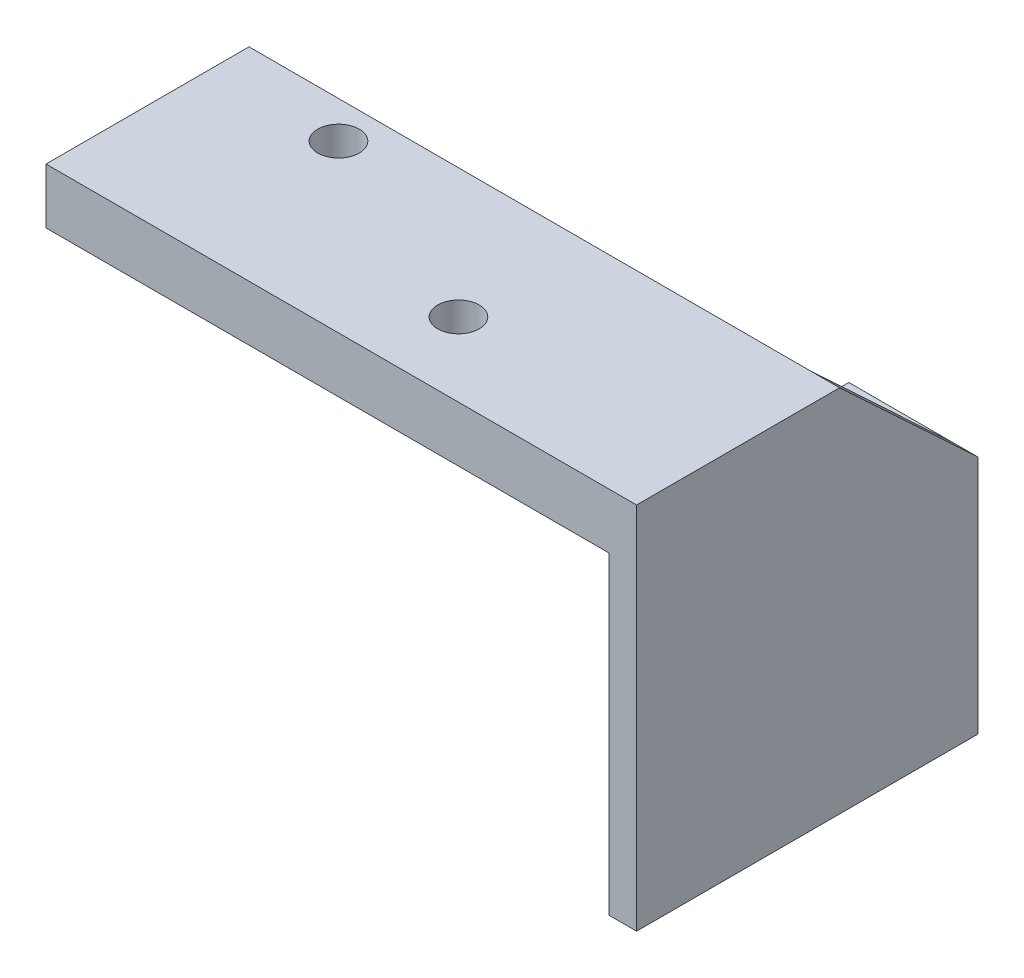
ISO-10303-21;
HEADER;
FILE_DESCRIPTION(('STEP AP214'),'2;1');
FILE_NAME('part.step','',(''),(''),'','','');
FILE_SCHEMA(('AUTOMOTIVE_DESIGN { 1 0 10303 214 1 1 1 1 }'));
ENDSEC;
DATA;
#1=APPLICATION_CONTEXT('core data for automotive mechanical design processes');
#2=APPLICATION_PROTOCOL_DEFINITION('international standard','automotive_design',2000,#1);
#3=PRODUCT_CONTEXT('',#1,'mechanical');
#4=PRODUCT('Part','Part','',(#3));
#5=PRODUCT_RELATED_PRODUCT_CATEGORY('part','',(#4));
#6=PRODUCT_DEFINITION_FORMATION('','',#4);
#7=PRODUCT_DEFINITION_CONTEXT('part definition',#1,'design');
#8=PRODUCT_DEFINITION('design','',#6,#7);
#9=PRODUCT_DEFINITION_SHAPE('','',#8);
#10=(LENGTH_UNIT() NAMED_UNIT(*) SI_UNIT(.MILLI.,.METRE.));
#11=(NAMED_UNIT(*) PLANE_ANGLE_UNIT() SI_UNIT($,.RADIAN.));
#12=(NAMED_UNIT(*) SI_UNIT($,.STERADIAN.) SOLID_ANGLE_UNIT());
#13=UNCERTAINTY_MEASURE_WITH_UNIT(LENGTH_MEASURE(1.E-05),#10,'distance_accuracy_value','');
#14=(GEOMETRIC_REPRESENTATION_CONTEXT(3) GLOBAL_UNCERTAINTY_ASSIGNED_CONTEXT((#13)) GLOBAL_UNIT_ASSIGNED_CONTEXT((#10,
#11,#12)) REPRESENTATION_CONTEXT('',''));
#15=CARTESIAN_POINT('',(0.,0.,0.));
#16=DIRECTION('',(0.,0.,1.));
#17=DIRECTION('',(1.,0.,0.));
#18=AXIS2_PLACEMENT_3D('',#15,#16,#17);
#19=CARTESIAN_POINT('',(0.,13.,0.));
#20=DIRECTION('',(0.,-1.,0.));
#21=DIRECTION('',(0.,0.,-1.));
#22=AXIS2_PLACEMENT_3D('',#19,#20,#21);
#23=PLANE('',#22);
#24=DIRECTION('',(0.,0.,1.));
#25=VECTOR('',#24,1.);
#26=CARTESIAN_POINT('',(5.50000000000001,13.,0.));
#27=LINE('',#26,#25);
#28=CARTESIAN_POINT('',(5.50000000000001,13.,0.));
#29=VERTEX_POINT('',#28);
#30=CARTESIAN_POINT('',(5.50000000000001,13.,9.));
#31=VERTEX_POINT('',#30);
#32=EDGE_CURVE('E48',#29,#31,#27,.T.);
#33=ORIENTED_EDGE('',*,*,#32,.F.);
#34=DIRECTION('',(1.,0.,0.));
#35=VECTOR('',#34,1.);
#36=CARTESIAN_POINT('',(5.50000000000001,13.,0.));
#37=LINE('',#36,#35);
#38=CARTESIAN_POINT('',(-5.5,13.,0.));
#39=VERTEX_POINT('',#38);
#40=EDGE_CURVE('E153',#39,#29,#37,.T.);
#41=ORIENTED_EDGE('',*,*,#40,.F.);
#42=DIRECTION('',(0.,0.,-1.));
#43=VECTOR('',#42,1.);
#44=CARTESIAN_POINT('',(-5.5,13.,0.));
#45=LINE('',#44,#43);
#46=CARTESIAN_POINT('',(-5.5,13.,9.));
#47=VERTEX_POINT('',#46);
#48=EDGE_CURVE('E150',#47,#39,#45,.T.);
#49=ORIENTED_EDGE('',*,*,#48,.F.);
#50=DIRECTION('',(-1.,0.,0.));
#51=VECTOR('',#50,1.);
#52=CARTESIAN_POINT('',(5.5,13.,9.));
#53=LINE('',#52,#51);
#54=EDGE_CURVE('E177',#31,#47,#53,.T.);
#55=ORIENTED_EDGE('',*,*,#54,.F.);
#56=EDGE_LOOP('',(#33,#41,#49,#55));
#57=FACE_BOUND('',#56,.T.);
#58=ADVANCED_FACE('F33',(#57),#23,.F.);
#59=CARTESIAN_POINT('',(-55.5,-44.7343137181792,15.));
#60=DIRECTION('',(0.,0.,1.));
#61=DIRECTION('',(1.,0.,0.));
#62=AXIS2_PLACEMENT_3D('',#59,#60,#61);
#63=PLANE('',#62);
#64=DIRECTION('',(0.,1.,0.));
#65=VECTOR('',#64,1.);
#66=CARTESIAN_POINT('',(5.50000000000001,-44.7343137181792,15.));
#67=LINE('',#66,#65);
#68=CARTESIAN_POINT('',(5.50000000000001,21.,15.));
#69=VERTEX_POINT('',#68);
#70=CARTESIAN_POINT('',(5.50000000000001,27.,15.));
#71=VERTEX_POINT('',#70);
#72=EDGE_CURVE('E11',#69,#71,#67,.T.);
#73=ORIENTED_EDGE('',*,*,#72,.F.);
#74=DIRECTION('',(-1.,0.,0.));
#75=VECTOR('',#74,1.);
#76=CARTESIAN_POINT('',(-55.5,21.,15.));
#77=LINE('',#76,#75);
#78=CARTESIAN_POINT('',(-55.5,21.,15.));
#79=VERTEX_POINT('',#78);
#80=EDGE_CURVE('E148',#69,#79,#77,.T.);
#81=ORIENTED_EDGE('',*,*,#80,.T.);
#82=DIRECTION('',(0.,1.,0.));
#83=VECTOR('',#82,1.);
#84=CARTESIAN_POINT('',(-55.5,-44.7343137181792,15.));
#85=LINE('',#84,#83);
#86=CARTESIAN_POINT('',(-55.5,27.,15.));
#87=VERTEX_POINT('',#86);
#88=EDGE_CURVE('E116',#79,#87,#85,.T.);
#89=ORIENTED_EDGE('',*,*,#88,.T.);
#90=DIRECTION('',(1.,0.,0.));
#91=VECTOR('',#90,1.);
#92=CARTESIAN_POINT('',(-55.5,27.,15.));
#93=LINE('',#92,#91);
#94=EDGE_CURVE('E111',#87,#71,#93,.T.);
#95=ORIENTED_EDGE('',*,*,#94,.T.);
#96=EDGE_LOOP('',(#73,#81,#89,#95));
#97=FACE_BOUND('',#96,.T.);
#98=ADVANCED_FACE('F113',(#97),#63,.F.);
#99=CARTESIAN_POINT('',(0.,0.,0.));
#100=DIRECTION('',(0.,0.,-1.));
#101=DIRECTION('',(-1.,0.,0.));
#102=AXIS2_PLACEMENT_3D('',#99,#100,#101);
#103=PLANE('',#102);
#104=ORIENTED_EDGE('',*,*,#40,.T.);
#105=DIRECTION('',(-1.,0.,0.));
#106=VECTOR('',#105,1.);
#107=CARTESIAN_POINT('',(8.50000000000001,13.,0.));
#108=LINE('',#107,#106);
#109=CARTESIAN_POINT('',(8.50000000000001,13.,0.));
#110=VERTEX_POINT('',#109);
#111=EDGE_CURVE('E120',#110,#29,#108,.T.);
#112=ORIENTED_EDGE('',*,*,#111,.F.);
#113=DIRECTION('',(0.,1.,0.));
#114=VECTOR('',#113,1.);
#115=CARTESIAN_POINT('',(8.50000000000001,27.,0.));
#116=LINE('',#115,#114);
#117=CARTESIAN_POINT('',(8.50000000000001,-13.,0.));
#118=VERTEX_POINT('',#117);
#119=EDGE_CURVE('E164',#118,#110,#116,.T.);
#120=ORIENTED_EDGE('',*,*,#119,.F.);
#121=DIRECTION('',(1.,0.,0.));
#122=VECTOR('',#121,1.);
#123=CARTESIAN_POINT('',(5.50000000000001,-13.,0.));
#124=LINE('',#123,#122);
#125=CARTESIAN_POINT('',(-5.50000000000001,-13.,0.));
#126=VERTEX_POINT('',#125);
#127=EDGE_CURVE('E174',#126,#118,#124,.T.);
#128=ORIENTED_EDGE('',*,*,#127,.F.);
#129=DIRECTION('',(0.,-1.,0.));
#130=VECTOR('',#129,1.);
#131=CARTESIAN_POINT('',(-5.50000000000001,27.,0.));
#132=LINE('',#131,#130);
#133=EDGE_CURVE('E210',#39,#126,#132,.T.);
#134=ORIENTED_EDGE('',*,*,#133,.F.);
#135=EDGE_LOOP('',(#104,#112,#120,#128,#134));
#136=FACE_BOUND('',#135,.T.);
#137=CARTESIAN_POINT('',(0.,7.5,0.));
#138=DIRECTION('',(0.,0.,1.));
#139=DIRECTION('',(1.,0.,0.));
#140=AXIS2_PLACEMENT_3D('',#137,#138,#139);
#141=CIRCLE('',#140,1.7);
#142=CARTESIAN_POINT('',(1.7,7.5,0.));
#143=VERTEX_POINT('',#142);
#144=EDGE_CURVE('E176',#143,#143,#141,.T.);
#145=ORIENTED_EDGE('',*,*,#144,.T.);
#146=EDGE_LOOP('',(#145));
#147=FACE_BOUND('',#146,.T.);
#148=CARTESIAN_POINT('',(0.,-7.5,0.));
#149=DIRECTION('',(0.,0.,1.));
#150=DIRECTION('',(1.,0.,0.));
#151=AXIS2_PLACEMENT_3D('',#148,#149,#150);
#152=CIRCLE('',#151,1.7);
#153=CARTESIAN_POINT('',(1.70000000000002,-7.5,0.));
#154=VERTEX_POINT('',#153);
#155=EDGE_CURVE('E182',#154,#154,#152,.T.);
#156=ORIENTED_EDGE('',*,*,#155,.T.);
#157=EDGE_LOOP('',(#156));
#158=FACE_BOUND('',#157,.T.);
#159=ADVANCED_FACE('F35',(#136,#147,#158),#103,.T.);
#160=CARTESIAN_POINT('',(-55.5,27.,37.));
#161=DIRECTION('',(0.,0.,1.));
#162=DIRECTION('',(1.,0.,0.));
#163=AXIS2_PLACEMENT_3D('',#160,#161,#162);
#164=PLANE('',#163);
#165=DIRECTION('',(-1.,0.,0.));
#166=VECTOR('',#165,1.);
#167=CARTESIAN_POINT('',(-55.5,21.,37.));
#168=LINE('',#167,#166);
#169=CARTESIAN_POINT('',(5.50000000000001,21.,37.));
#170=VERTEX_POINT('',#169);
#171=CARTESIAN_POINT('',(-55.5,21.,37.));
#172=VERTEX_POINT('',#171);
#173=EDGE_CURVE('E215',#170,#172,#168,.T.);
#174=ORIENTED_EDGE('',*,*,#173,.F.);
#175=DIRECTION('',(0.,-1.,0.));
#176=VECTOR('',#175,1.);
#177=CARTESIAN_POINT('',(5.50000000000001,27.,37.));
#178=LINE('',#177,#176);
#179=CARTESIAN_POINT('',(5.50000000000001,-13.,37.));
#180=VERTEX_POINT('',#179);
#181=EDGE_CURVE('E155',#170,#180,#178,.T.);
#182=ORIENTED_EDGE('',*,*,#181,.T.);
#183=DIRECTION('',(-1.,0.,0.));
#184=VECTOR('',#183,1.);
#185=CARTESIAN_POINT('',(8.50000000000001,-13.,37.));
#186=LINE('',#185,#184);
#187=CARTESIAN_POINT('',(8.50000000000001,-13.,37.));
#188=VERTEX_POINT('',#187);
#189=EDGE_CURVE('E167',#188,#180,#186,.T.);
#190=ORIENTED_EDGE('',*,*,#189,.F.);
#191=DIRECTION('',(0.,-1.,0.));
#192=VECTOR('',#191,1.);
#193=CARTESIAN_POINT('',(8.50000000000001,27.,37.));
#194=LINE('',#193,#192);
#195=CARTESIAN_POINT('',(8.50000000000001,27.,37.));
#196=VERTEX_POINT('',#195);
#197=EDGE_CURVE('E158',#196,#188,#194,.T.);
#198=ORIENTED_EDGE('',*,*,#197,.F.);
#199=DIRECTION('',(-1.,0.,0.));
#200=VECTOR('',#199,1.);
#201=CARTESIAN_POINT('',(-55.5,27.,37.));
#202=LINE('',#201,#200);
#203=CARTESIAN_POINT('',(-55.5,27.,37.));
#204=VERTEX_POINT('',#203);
#205=EDGE_CURVE('E56',#196,#204,#202,.T.);
#206=ORIENTED_EDGE('',*,*,#205,.T.);
#207=DIRECTION('',(0.,-1.,0.));
#208=VECTOR('',#207,1.);
#209=CARTESIAN_POINT('',(-55.5,27.,37.));
#210=LINE('',#209,#208);
#211=EDGE_CURVE('E41',#204,#172,#210,.T.);
#212=ORIENTED_EDGE('',*,*,#211,.T.);
#213=EDGE_LOOP('',(#174,#182,#190,#198,#206,#212));
#214=FACE_BOUND('',#213,.T.);
#215=ADVANCED_FACE('F252',(#214),#164,.T.);
#216=CARTESIAN_POINT('',(-18.8013700905245,27.,29.00055804));
#217=DIRECTION('',(0.,1.,0.));
#218=DIRECTION('',(0.,0.,1.));
#219=AXIS2_PLACEMENT_3D('',#216,#217,#218);
#220=CYLINDRICAL_SURFACE('',#219,2.25);
#221=CARTESIAN_POINT('',(-18.8013700905245,21.,29.00055804));
#222=DIRECTION('',(0.,1.,0.));
#223=DIRECTION('',(0.,0.,1.));
#224=AXIS2_PLACEMENT_3D('',#221,#222,#223);
#225=CIRCLE('',#224,2.25);
#226=CARTESIAN_POINT('',(-18.8013700905245,21.,31.25055804));
#227=VERTEX_POINT('',#226);
#228=EDGE_CURVE('E221',#227,#227,#225,.F.);
#229=ORIENTED_EDGE('',*,*,#228,.T.);
#230=EDGE_LOOP('',(#229));
#231=FACE_BOUND('',#230,.T.);
#232=CARTESIAN_POINT('',(-18.8013700905245,27.,29.00055804));
#233=DIRECTION('',(0.,1.,0.));
#234=DIRECTION('',(0.,0.,1.));
#235=AXIS2_PLACEMENT_3D('',#232,#233,#234);
#236=CIRCLE('',#235,2.25);
#237=CARTESIAN_POINT('',(-18.8013700905245,27.,31.25055804));
#238=VERTEX_POINT('',#237);
#239=EDGE_CURVE('E227',#238,#238,#236,.T.);
#240=ORIENTED_EDGE('',*,*,#239,.T.);
#241=EDGE_LOOP('',(#240));
#242=FACE_BOUND('',#241,.T.);
#243=ADVANCED_FACE('F248',(#231,#242),#220,.F.);
#244=CARTESIAN_POINT('',(-55.5,27.,0.));
#245=DIRECTION('',(-1.,0.,0.));
#246=DIRECTION('',(0.,-1.,0.));
#247=AXIS2_PLACEMENT_3D('',#244,#245,#246);
#248=PLANE('',#247);
#249=ORIENTED_EDGE('',*,*,#88,.F.);
#250=DIRECTION('',(0.,0.,1.));
#251=VECTOR('',#250,1.);
#252=CARTESIAN_POINT('',(-55.5,21.,0.));
#253=LINE('',#252,#251);
#254=EDGE_CURVE('E218',#79,#172,#253,.T.);
#255=ORIENTED_EDGE('',*,*,#254,.T.);
#256=ORIENTED_EDGE('',*,*,#211,.F.);
#257=DIRECTION('',(0.,0.,-1.));
#258=VECTOR('',#257,1.);
#259=CARTESIAN_POINT('',(-55.5,27.,0.));
#260=LINE('',#259,#258);
#261=EDGE_CURVE('E231',#204,#87,#260,.T.);
#262=ORIENTED_EDGE('',*,*,#261,.T.);
#263=EDGE_LOOP('',(#249,#255,#256,#262));
#264=FACE_BOUND('',#263,.T.);
#265=ADVANCED_FACE('F251',(#264),#248,.T.);
#266=CARTESIAN_POINT('',(0.,27.,0.));
#267=DIRECTION('',(0.,1.,0.));
#268=DIRECTION('',(-1.,0.,0.));
#269=AXIS2_PLACEMENT_3D('',#266,#267,#268);
#270=PLANE('',#269);
#271=ORIENTED_EDGE('',*,*,#94,.F.);
#272=ORIENTED_EDGE('',*,*,#261,.F.);
#273=ORIENTED_EDGE('',*,*,#205,.F.);
#274=DIRECTION('',(0.,0.,1.));
#275=VECTOR('',#274,1.);
#276=CARTESIAN_POINT('',(8.50000000000001,27.,37.));
#277=LINE('',#276,#275);
#278=CARTESIAN_POINT('',(8.50000000000001,27.,15.));
#279=VERTEX_POINT('',#278);
#280=EDGE_CURVE('E126',#279,#196,#277,.T.);
#281=ORIENTED_EDGE('',*,*,#280,.F.);
#282=DIRECTION('',(-1.,0.,0.));
#283=VECTOR('',#282,1.);
#284=CARTESIAN_POINT('',(8.50000000000001,27.,15.));
#285=LINE('',#284,#283);
#286=EDGE_CURVE('E123',#279,#71,#285,.T.);
#287=ORIENTED_EDGE('',*,*,#286,.T.);
#288=EDGE_LOOP('',(#271,#272,#273,#281,#287));
#289=FACE_BOUND('',#288,.T.);
#290=CARTESIAN_POINT('',(-41.8013700905246,27.,19.0005580400004));
#291=DIRECTION('',(0.,1.,0.));
#292=DIRECTION('',(0.,0.,1.));
#293=AXIS2_PLACEMENT_3D('',#290,#291,#292);
#294=CIRCLE('',#293,2.25);
#295=CARTESIAN_POINT('',(-41.8013700905246,27.,21.2505580400004));
#296=VERTEX_POINT('',#295);
#297=EDGE_CURVE('E224',#296,#296,#294,.T.);
#298=ORIENTED_EDGE('',*,*,#297,.F.);
#299=EDGE_LOOP('',(#298));
#300=FACE_BOUND('',#299,.T.);
#301=ORIENTED_EDGE('',*,*,#239,.F.);
#302=EDGE_LOOP('',(#301));
#303=FACE_BOUND('',#302,.T.);
#304=ADVANCED_FACE('F124',(#289,#300,#303),#270,.T.);
#305=CARTESIAN_POINT('',(-41.8013700905246,27.,19.0005580400004));
#306=DIRECTION('',(0.,1.,0.));
#307=DIRECTION('',(0.,0.,1.));
#308=AXIS2_PLACEMENT_3D('',#305,#306,#307);
#309=CYLINDRICAL_SURFACE('',#308,2.25);
#310=CARTESIAN_POINT('',(-41.8013700905246,21.,19.0005580400004));
#311=DIRECTION('',(0.,1.,0.));
#312=DIRECTION('',(0.,0.,1.));
#313=AXIS2_PLACEMENT_3D('',#310,#311,#312);
#314=CIRCLE('',#313,2.25);
#315=CARTESIAN_POINT('',(-41.8013700905246,21.,21.2505580400004));
#316=VERTEX_POINT('',#315);
#317=EDGE_CURVE('E220',#316,#316,#314,.F.);
#318=ORIENTED_EDGE('',*,*,#317,.T.);
#319=EDGE_LOOP('',(#318));
#320=FACE_BOUND('',#319,.T.);
#321=ORIENTED_EDGE('',*,*,#297,.T.);
#322=EDGE_LOOP('',(#321));
#323=FACE_BOUND('',#322,.T.);
#324=ADVANCED_FACE('F236',(#320,#323),#309,.F.);
#325=CARTESIAN_POINT('',(-55.5,21.,0.));
#326=DIRECTION('',(0.,1.,0.));
#327=DIRECTION('',(0.,0.,1.));
#328=AXIS2_PLACEMENT_3D('',#325,#326,#327);
#329=PLANE('',#328);
#330=ORIENTED_EDGE('',*,*,#317,.F.);
#331=EDGE_LOOP('',(#330));
#332=FACE_BOUND('',#331,.T.);
#333=ORIENTED_EDGE('',*,*,#254,.F.);
#334=ORIENTED_EDGE('',*,*,#80,.F.);
#335=DIRECTION('',(0.,0.,1.));
#336=VECTOR('',#335,1.);
#337=CARTESIAN_POINT('',(5.50000000000001,21.,0.));
#338=LINE('',#337,#336);
#339=EDGE_CURVE('E139',#69,#170,#338,.T.);
#340=ORIENTED_EDGE('',*,*,#339,.T.);
#341=ORIENTED_EDGE('',*,*,#173,.T.);
#342=EDGE_LOOP('',(#333,#334,#340,#341));
#343=FACE_BOUND('',#342,.T.);
#344=ORIENTED_EDGE('',*,*,#228,.F.);
#345=EDGE_LOOP('',(#344));
#346=FACE_BOUND('',#345,.T.);
#347=ADVANCED_FACE('F239',(#332,#343,#346),#329,.F.);
#348=CARTESIAN_POINT('',(-5.50000000000001,27.,0.));
#349=DIRECTION('',(-1.,0.,0.));
#350=DIRECTION('',(0.,-1.,0.));
#351=AXIS2_PLACEMENT_3D('',#348,#349,#350);
#352=PLANE('',#351);
#353=ORIENTED_EDGE('',*,*,#48,.T.);
#354=ORIENTED_EDGE('',*,*,#133,.T.);
#355=DIRECTION('',(0.,0.,1.));
#356=VECTOR('',#355,1.);
#357=CARTESIAN_POINT('',(-5.50000000000001,-13.,0.));
#358=LINE('',#357,#356);
#359=CARTESIAN_POINT('',(-5.50000000000001,-13.,9.));
#360=VERTEX_POINT('',#359);
#361=EDGE_CURVE('E180',#126,#360,#358,.T.);
#362=ORIENTED_EDGE('',*,*,#361,.T.);
#363=DIRECTION('',(0.,1.,0.));
#364=VECTOR('',#363,1.);
#365=CARTESIAN_POINT('',(-5.50000000000001,-13.,9.));
#366=LINE('',#365,#364);
#367=EDGE_CURVE('E207',#360,#47,#366,.T.);
#368=ORIENTED_EDGE('',*,*,#367,.T.);
#369=EDGE_LOOP('',(#353,#354,#362,#368));
#370=FACE_BOUND('',#369,.T.);
#371=ADVANCED_FACE('F242',(#370),#352,.T.);
#372=CARTESIAN_POINT('',(5.50000000000001,-13.,9.));
#373=DIRECTION('',(0.,1.,0.));
#374=DIRECTION('',(-1.,0.,0.));
#375=AXIS2_PLACEMENT_3D('',#372,#373,#374);
#376=PLANE('',#375);
#377=DIRECTION('',(-1.,0.,0.));
#378=VECTOR('',#377,1.);
#379=CARTESIAN_POINT('',(-5.50000000000001,-13.,9.));
#380=LINE('',#379,#378);
#381=CARTESIAN_POINT('',(5.50000000000001,-13.,9.));
#382=VERTEX_POINT('',#381);
#383=EDGE_CURVE('E173',#382,#360,#380,.T.);
#384=ORIENTED_EDGE('',*,*,#383,.T.);
#385=ORIENTED_EDGE('',*,*,#361,.F.);
#386=ORIENTED_EDGE('',*,*,#127,.T.);
#387=DIRECTION('',(0.,0.,-1.));
#388=VECTOR('',#387,1.);
#389=CARTESIAN_POINT('',(8.50000000000001,-13.,0.));
#390=LINE('',#389,#388);
#391=EDGE_CURVE('E161',#188,#118,#390,.T.);
#392=ORIENTED_EDGE('',*,*,#391,.F.);
#393=ORIENTED_EDGE('',*,*,#189,.T.);
#394=DIRECTION('',(0.,0.,-1.));
#395=VECTOR('',#394,1.);
#396=CARTESIAN_POINT('',(5.50000000000001,-13.,0.));
#397=LINE('',#396,#395);
#398=EDGE_CURVE('E159',#180,#382,#397,.T.);
#399=ORIENTED_EDGE('',*,*,#398,.T.);
#400=EDGE_LOOP('',(#384,#385,#386,#392,#393,#399));
#401=FACE_BOUND('',#400,.T.);
#402=ADVANCED_FACE('F280',(#401),#376,.F.);
#403=CARTESIAN_POINT('',(0.,-7.5,9.));
#404=DIRECTION('',(0.,0.,1.));
#405=DIRECTION('',(1.,0.,0.));
#406=AXIS2_PLACEMENT_3D('',#403,#404,#405);
#407=CYLINDRICAL_SURFACE('',#406,1.7);
#408=ORIENTED_EDGE('',*,*,#155,.F.);
#409=EDGE_LOOP('',(#408));
#410=FACE_BOUND('',#409,.T.);
#411=CARTESIAN_POINT('',(0.,-7.5,6.6));
#412=DIRECTION('',(0.,0.,1.));
#413=DIRECTION('',(1.,0.,0.));
#414=AXIS2_PLACEMENT_3D('',#411,#412,#413);
#415=CIRCLE('',#414,1.7);
#416=CARTESIAN_POINT('',(1.70000000000002,-7.5,6.6));
#417=VERTEX_POINT('',#416);
#418=EDGE_CURVE('E185',#417,#417,#415,.T.);
#419=ORIENTED_EDGE('',*,*,#418,.T.);
#420=EDGE_LOOP('',(#419));
#421=FACE_BOUND('',#420,.T.);
#422=ADVANCED_FACE('F283',(#410,#421),#407,.F.);
#423=CARTESIAN_POINT('',(1.70000000000002,-7.5,6.6));
#424=DIRECTION('',(0.,0.,-1.));
#425=DIRECTION('',(-1.,0.,0.));
#426=AXIS2_PLACEMENT_3D('',#423,#424,#425);
#427=PLANE('',#426);
#428=ORIENTED_EDGE('',*,*,#418,.F.);
#429=EDGE_LOOP('',(#428));
#430=FACE_BOUND('',#429,.T.);
#431=CARTESIAN_POINT('',(0.,-7.5,6.6));
#432=DIRECTION('',(0.,0.,1.));
#433=DIRECTION('',(1.,0.,0.));
#434=AXIS2_PLACEMENT_3D('',#431,#432,#433);
#435=CIRCLE('',#434,3.5);
#436=CARTESIAN_POINT('',(3.50000000000002,-7.5,6.6));
#437=VERTEX_POINT('',#436);
#438=EDGE_CURVE('E188',#437,#437,#435,.T.);
#439=ORIENTED_EDGE('',*,*,#438,.T.);
#440=EDGE_LOOP('',(#439));
#441=FACE_BOUND('',#440,.T.);
#442=ADVANCED_FACE('F287',(#430,#441),#427,.F.);
#443=CARTESIAN_POINT('',(0.,-7.5,9.));
#444=DIRECTION('',(0.,0.,1.));
#445=DIRECTION('',(1.,0.,0.));
#446=AXIS2_PLACEMENT_3D('',#443,#444,#445);
#447=CYLINDRICAL_SURFACE('',#446,3.5);
#448=ORIENTED_EDGE('',*,*,#438,.F.);
#449=EDGE_LOOP('',(#448));
#450=FACE_BOUND('',#449,.T.);
#451=CARTESIAN_POINT('',(0.,-7.5,9.));
#452=DIRECTION('',(0.,0.,-1.));
#453=DIRECTION('',(-1.,0.,0.));
#454=AXIS2_PLACEMENT_3D('',#451,#452,#453);
#455=CIRCLE('',#454,3.5);
#456=CARTESIAN_POINT('',(-3.49999999999998,-7.5,9.));
#457=VERTEX_POINT('',#456);
#458=EDGE_CURVE('E191',#457,#457,#455,.F.);
#459=ORIENTED_EDGE('',*,*,#458,.T.);
#460=EDGE_LOOP('',(#459));
#461=FACE_BOUND('',#460,.T.);
#462=ADVANCED_FACE('F291',(#450,#461),#447,.F.);
#463=CARTESIAN_POINT('',(0.,7.5,9.));
#464=DIRECTION('',(0.,0.,1.));
#465=DIRECTION('',(1.,0.,0.));
#466=AXIS2_PLACEMENT_3D('',#463,#464,#465);
#467=CYLINDRICAL_SURFACE('',#466,1.7);
#468=ORIENTED_EDGE('',*,*,#144,.F.);
#469=EDGE_LOOP('',(#468));
#470=FACE_BOUND('',#469,.T.);
#471=CARTESIAN_POINT('',(0.,7.5,6.6));
#472=DIRECTION('',(0.,0.,1.));
#473=DIRECTION('',(1.,0.,0.));
#474=AXIS2_PLACEMENT_3D('',#471,#472,#473);
#475=CIRCLE('',#474,1.7);
#476=CARTESIAN_POINT('',(1.7,7.5,6.6));
#477=VERTEX_POINT('',#476);
#478=EDGE_CURVE('E194',#477,#477,#475,.T.);
#479=ORIENTED_EDGE('',*,*,#478,.T.);
#480=EDGE_LOOP('',(#479));
#481=FACE_BOUND('',#480,.T.);
#482=ADVANCED_FACE('F295',(#470,#481),#467,.F.);
#483=CARTESIAN_POINT('',(1.7,7.5,6.6));
#484=DIRECTION('',(0.,0.,-1.));
#485=DIRECTION('',(-1.,0.,0.));
#486=AXIS2_PLACEMENT_3D('',#483,#484,#485);
#487=PLANE('',#486);
#488=ORIENTED_EDGE('',*,*,#478,.F.);
#489=EDGE_LOOP('',(#488));
#490=FACE_BOUND('',#489,.T.);
#491=CARTESIAN_POINT('',(0.,7.5,6.6));
#492=DIRECTION('',(0.,0.,1.));
#493=DIRECTION('',(1.,0.,0.));
#494=AXIS2_PLACEMENT_3D('',#491,#492,#493);
#495=CIRCLE('',#494,3.5);
#496=CARTESIAN_POINT('',(3.5,7.5,6.6));
#497=VERTEX_POINT('',#496);
#498=EDGE_CURVE('E197',#497,#497,#495,.T.);
#499=ORIENTED_EDGE('',*,*,#498,.T.);
#500=EDGE_LOOP('',(#499));
#501=FACE_BOUND('',#500,.T.);
#502=ADVANCED_FACE('F299',(#490,#501),#487,.F.);
#503=CARTESIAN_POINT('',(0.,7.5,9.));
#504=DIRECTION('',(0.,0.,1.));
#505=DIRECTION('',(1.,0.,0.));
#506=AXIS2_PLACEMENT_3D('',#503,#504,#505);
#507=CYLINDRICAL_SURFACE('',#506,3.5);
#508=ORIENTED_EDGE('',*,*,#498,.F.);
#509=EDGE_LOOP('',(#508));
#510=FACE_BOUND('',#509,.T.);
#511=CARTESIAN_POINT('',(0.,7.5,9.));
#512=DIRECTION('',(0.,0.,-1.));
#513=DIRECTION('',(-1.,0.,0.));
#514=AXIS2_PLACEMENT_3D('',#511,#512,#513);
#515=CIRCLE('',#514,3.5);
#516=CARTESIAN_POINT('',(-3.5,7.5,9.));
#517=VERTEX_POINT('',#516);
#518=EDGE_CURVE('E200',#517,#517,#515,.F.);
#519=ORIENTED_EDGE('',*,*,#518,.T.);
#520=EDGE_LOOP('',(#519));
#521=FACE_BOUND('',#520,.T.);
#522=ADVANCED_FACE('F303',(#510,#521),#507,.F.);
#523=CARTESIAN_POINT('',(-5.50000000000001,-13.,9.));
#524=DIRECTION('',(0.,0.,-1.));
#525=DIRECTION('',(-1.,0.,0.));
#526=AXIS2_PLACEMENT_3D('',#523,#524,#525);
#527=PLANE('',#526);
#528=ORIENTED_EDGE('',*,*,#458,.F.);
#529=EDGE_LOOP('',(#528));
#530=FACE_BOUND('',#529,.T.);
#531=ORIENTED_EDGE('',*,*,#367,.F.);
#532=ORIENTED_EDGE('',*,*,#383,.F.);
#533=DIRECTION('',(0.,1.,0.));
#534=VECTOR('',#533,1.);
#535=CARTESIAN_POINT('',(5.5,-13.,9.));
#536=LINE('',#535,#534);
#537=EDGE_CURVE('E181',#382,#31,#536,.T.);
#538=ORIENTED_EDGE('',*,*,#537,.T.);
#539=ORIENTED_EDGE('',*,*,#54,.T.);
#540=EDGE_LOOP('',(#531,#532,#538,#539));
#541=FACE_BOUND('',#540,.T.);
#542=ORIENTED_EDGE('',*,*,#518,.F.);
#543=EDGE_LOOP('',(#542));
#544=FACE_BOUND('',#543,.T.);
#545=ADVANCED_FACE('F279',(#530,#541,#544),#527,.F.);
#546=CARTESIAN_POINT('',(5.50000000000001,0.,0.));
#547=DIRECTION('',(-1.,0.,0.));
#548=DIRECTION('',(0.,0.,1.));
#549=AXIS2_PLACEMENT_3D('',#546,#547,#548);
#550=PLANE('',#549);
#551=ORIENTED_EDGE('',*,*,#339,.F.);
#552=ORIENTED_EDGE('',*,*,#72,.T.);
#553=DIRECTION('',(0.,-0.682318250360011,-0.731055268242869));
#554=VECTOR('',#553,1.);
#555=CARTESIAN_POINT('',(5.50000000000001,27.,15.));
#556=LINE('',#555,#554);
#557=EDGE_CURVE('E137',#71,#29,#556,.T.);
#558=ORIENTED_EDGE('',*,*,#557,.T.);
#559=ORIENTED_EDGE('',*,*,#32,.T.);
#560=ORIENTED_EDGE('',*,*,#537,.F.);
#561=ORIENTED_EDGE('',*,*,#398,.F.);
#562=ORIENTED_EDGE('',*,*,#181,.F.);
#563=EDGE_LOOP('',(#551,#552,#558,#559,#560,#561,#562));
#564=FACE_BOUND('',#563,.T.);
#565=ADVANCED_FACE('F136',(#564),#550,.T.);
#566=CARTESIAN_POINT('',(8.50000000000001,0.,0.));
#567=DIRECTION('',(-1.,0.,0.));
#568=DIRECTION('',(0.,0.,1.));
#569=AXIS2_PLACEMENT_3D('',#566,#567,#568);
#570=PLANE('',#569);
#571=ORIENTED_EDGE('',*,*,#119,.T.);
#572=DIRECTION('',(0.,-0.682318250360011,-0.731055268242869));
#573=VECTOR('',#572,1.);
#574=CARTESIAN_POINT('',(8.50000000000001,27.,15.));
#575=LINE('',#574,#573);
#576=EDGE_CURVE('E131',#279,#110,#575,.T.);
#577=ORIENTED_EDGE('',*,*,#576,.F.);
#578=ORIENTED_EDGE('',*,*,#280,.T.);
#579=ORIENTED_EDGE('',*,*,#197,.T.);
#580=ORIENTED_EDGE('',*,*,#391,.T.);
#581=EDGE_LOOP('',(#571,#577,#578,#579,#580));
#582=FACE_BOUND('',#581,.T.);
#583=ADVANCED_FACE('F273',(#582),#570,.F.);
#584=CARTESIAN_POINT('',(8.50000000000001,27.,15.));
#585=DIRECTION('',(0.,0.731055268242869,-0.682318250360011));
#586=DIRECTION('',(0.,0.682318250360011,0.731055268242869));
#587=AXIS2_PLACEMENT_3D('',#584,#585,#586);
#588=PLANE('',#587);
#589=ORIENTED_EDGE('',*,*,#557,.F.);
#590=ORIENTED_EDGE('',*,*,#286,.F.);
#591=ORIENTED_EDGE('',*,*,#576,.T.);
#592=ORIENTED_EDGE('',*,*,#111,.T.);
#593=EDGE_LOOP('',(#589,#590,#591,#592));
#594=FACE_BOUND('',#593,.T.);
#595=ADVANCED_FACE('F141',(#594),#588,.T.);
#596=CLOSED_SHELL('',(#58,#98,#159,#215,#243,#265,#304,#324,#347,#371,#402,#422,#442,#462,#482,
#502,#522,#545,#565,#583,#595));
#597=MANIFOLD_SOLID_BREP('B2',#596);
#598=ADVANCED_BREP_SHAPE_REPRESENTATION('',(#18,#597),#14);
#599=SHAPE_DEFINITION_REPRESENTATION(#9,#598);
ENDSEC;
END-ISO-10303-21;
